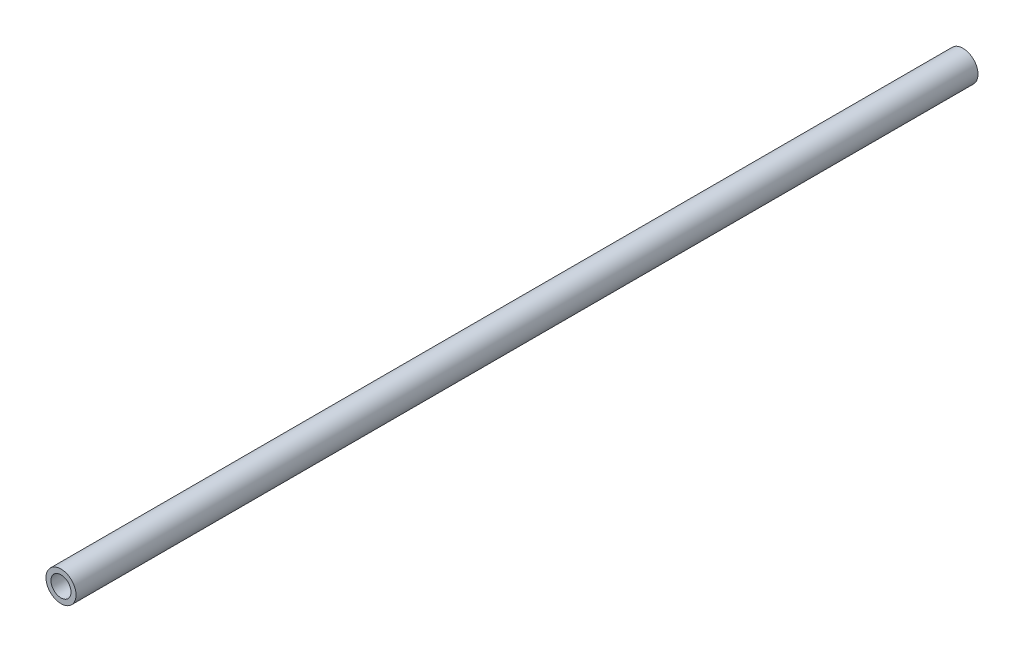
ISO-10303-21;
HEADER;
FILE_DESCRIPTION(('STEP AP214'),'2;1');
FILE_NAME('part.step','',(''),(''),'','','');
FILE_SCHEMA(('AUTOMOTIVE_DESIGN { 1 0 10303 214 1 1 1 1 }'));
ENDSEC;
DATA;
#1=APPLICATION_CONTEXT('core data for automotive mechanical design processes');
#2=APPLICATION_PROTOCOL_DEFINITION('international standard','automotive_design',2000,#1);
#3=PRODUCT_CONTEXT('',#1,'mechanical');
#4=PRODUCT('Part','Part','',(#3));
#5=PRODUCT_RELATED_PRODUCT_CATEGORY('part','',(#4));
#6=PRODUCT_DEFINITION_FORMATION('','',#4);
#7=PRODUCT_DEFINITION_CONTEXT('part definition',#1,'design');
#8=PRODUCT_DEFINITION('design','',#6,#7);
#9=PRODUCT_DEFINITION_SHAPE('','',#8);
#10=(LENGTH_UNIT() NAMED_UNIT(*) SI_UNIT(.MILLI.,.METRE.));
#11=(NAMED_UNIT(*) PLANE_ANGLE_UNIT() SI_UNIT($,.RADIAN.));
#12=(NAMED_UNIT(*) SI_UNIT($,.STERADIAN.) SOLID_ANGLE_UNIT());
#13=UNCERTAINTY_MEASURE_WITH_UNIT(LENGTH_MEASURE(1.E-05),#10,'distance_accuracy_value','');
#14=(GEOMETRIC_REPRESENTATION_CONTEXT(3) GLOBAL_UNCERTAINTY_ASSIGNED_CONTEXT((#13)) GLOBAL_UNIT_ASSIGNED_CONTEXT((#10,
#11,#12)) REPRESENTATION_CONTEXT('',''));
#15=CARTESIAN_POINT('',(0.,0.,0.));
#16=DIRECTION('',(0.,0.,1.));
#17=DIRECTION('',(1.,0.,0.));
#18=AXIS2_PLACEMENT_3D('',#15,#16,#17);
#19=CARTESIAN_POINT('',(390.761403900086,31.0815288811455,450.));
#20=DIRECTION('',(0.,0.,1.));
#21=DIRECTION('',(1.,0.,0.));
#22=AXIS2_PLACEMENT_3D('',#19,#20,#21);
#23=PLANE('',#22);
#24=CARTESIAN_POINT('',(390.761403900086,31.0815288811455,450.));
#25=DIRECTION('',(0.,0.,1.));
#26=DIRECTION('',(1.,0.,0.));
#27=AXIS2_PLACEMENT_3D('',#24,#25,#26);
#28=CIRCLE('',#27,7.50000000000001);
#29=CARTESIAN_POINT('',(398.261403900086,31.0815288811455,450.));
#30=VERTEX_POINT('',#29);
#31=EDGE_CURVE('E10',#30,#30,#28,.T.);
#32=ORIENTED_EDGE('',*,*,#31,.T.);
#33=EDGE_LOOP('',(#32));
#34=FACE_BOUND('',#33,.T.);
#35=CARTESIAN_POINT('',(390.761403900086,31.0815288811455,450.));
#36=DIRECTION('',(0.,0.,1.));
#37=DIRECTION('',(1.,0.,0.));
#38=AXIS2_PLACEMENT_3D('',#35,#36,#37);
#39=CIRCLE('',#38,4.99999999999999);
#40=CARTESIAN_POINT('',(395.761403900086,31.0815288811455,450.));
#41=VERTEX_POINT('',#40);
#42=EDGE_CURVE('E44',#41,#41,#39,.T.);
#43=ORIENTED_EDGE('',*,*,#42,.F.);
#44=EDGE_LOOP('',(#43));
#45=FACE_BOUND('',#44,.T.);
#46=ADVANCED_FACE('F33',(#34,#45),#23,.T.);
#47=CARTESIAN_POINT('',(390.761403900086,31.0815288811455,0.));
#48=DIRECTION('',(0.,0.,1.));
#49=DIRECTION('',(1.,0.,0.));
#50=AXIS2_PLACEMENT_3D('',#47,#48,#49);
#51=PLANE('',#50);
#52=CARTESIAN_POINT('',(390.761403900086,31.0815288811455,0.));
#53=DIRECTION('',(0.,0.,1.));
#54=DIRECTION('',(1.,0.,0.));
#55=AXIS2_PLACEMENT_3D('',#52,#53,#54);
#56=CIRCLE('',#55,7.50000000000001);
#57=CARTESIAN_POINT('',(398.261403900086,31.0815288811455,0.));
#58=VERTEX_POINT('',#57);
#59=EDGE_CURVE('E37',#58,#58,#56,.T.);
#60=ORIENTED_EDGE('',*,*,#59,.F.);
#61=EDGE_LOOP('',(#60));
#62=FACE_BOUND('',#61,.T.);
#63=CARTESIAN_POINT('',(390.761403900086,31.0815288811455,0.));
#64=DIRECTION('',(0.,0.,1.));
#65=DIRECTION('',(1.,0.,0.));
#66=AXIS2_PLACEMENT_3D('',#63,#64,#65);
#67=CIRCLE('',#66,4.99999999999999);
#68=CARTESIAN_POINT('',(395.761403900086,31.0815288811455,0.));
#69=VERTEX_POINT('',#68);
#70=EDGE_CURVE('E46',#69,#69,#67,.T.);
#71=ORIENTED_EDGE('',*,*,#70,.T.);
#72=EDGE_LOOP('',(#71));
#73=FACE_BOUND('',#72,.T.);
#74=ADVANCED_FACE('F56',(#62,#73),#51,.F.);
#75=CARTESIAN_POINT('',(390.761403900086,31.0815288811455,450.));
#76=DIRECTION('',(0.,0.,-1.));
#77=DIRECTION('',(-1.,0.,0.));
#78=AXIS2_PLACEMENT_3D('',#75,#76,#77);
#79=CYLINDRICAL_SURFACE('',#78,7.50000000000001);
#80=ORIENTED_EDGE('',*,*,#31,.F.);
#81=EDGE_LOOP('',(#80));
#82=FACE_BOUND('',#81,.T.);
#83=ORIENTED_EDGE('',*,*,#59,.T.);
#84=EDGE_LOOP('',(#83));
#85=FACE_BOUND('',#84,.T.);
#86=ADVANCED_FACE('F35',(#82,#85),#79,.T.);
#87=CARTESIAN_POINT('',(390.761403900086,31.0815288811455,450.));
#88=DIRECTION('',(0.,0.,-1.));
#89=DIRECTION('',(-1.,0.,0.));
#90=AXIS2_PLACEMENT_3D('',#87,#88,#89);
#91=CYLINDRICAL_SURFACE('',#90,4.99999999999999);
#92=ORIENTED_EDGE('',*,*,#42,.T.);
#93=EDGE_LOOP('',(#92));
#94=FACE_BOUND('',#93,.T.);
#95=ORIENTED_EDGE('',*,*,#70,.F.);
#96=EDGE_LOOP('',(#95));
#97=FACE_BOUND('',#96,.T.);
#98=ADVANCED_FACE('F52',(#94,#97),#91,.F.);
#99=CLOSED_SHELL('',(#46,#74,#86,#98));
#100=MANIFOLD_SOLID_BREP('B2',#99);
#101=ADVANCED_BREP_SHAPE_REPRESENTATION('',(#18,#100),#14);
#102=SHAPE_DEFINITION_REPRESENTATION(#9,#101);
ENDSEC;
END-ISO-10303-21;
